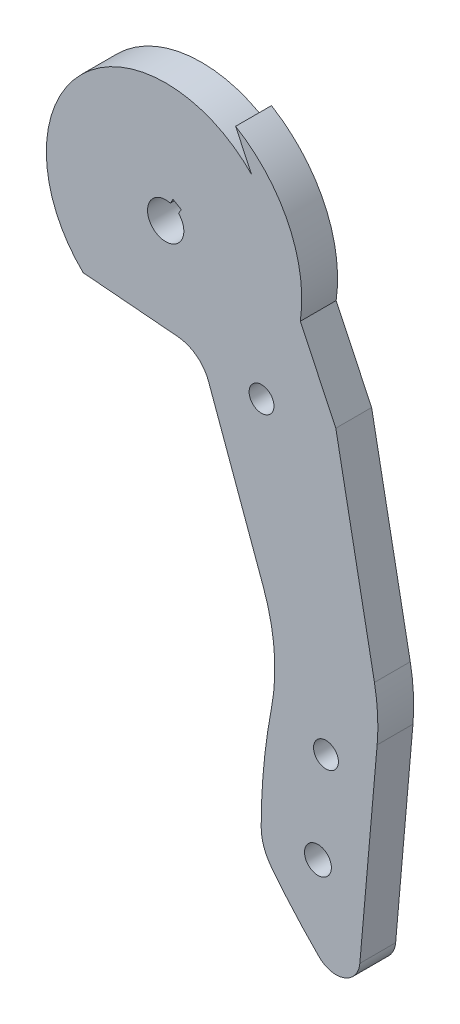
ISO-10303-21;
HEADER;
FILE_DESCRIPTION(('STEP AP214'),'2;1');
FILE_NAME('part.step','',(''),(''),'','','');
FILE_SCHEMA(('AUTOMOTIVE_DESIGN { 1 0 10303 214 1 1 1 1 }'));
ENDSEC;
DATA;
#1=APPLICATION_CONTEXT('core data for automotive mechanical design processes');
#2=APPLICATION_PROTOCOL_DEFINITION('international standard','automotive_design',2000,#1);
#3=PRODUCT_CONTEXT('',#1,'mechanical');
#4=PRODUCT('Part','Part','',(#3));
#5=PRODUCT_RELATED_PRODUCT_CATEGORY('part','',(#4));
#6=PRODUCT_DEFINITION_FORMATION('','',#4);
#7=PRODUCT_DEFINITION_CONTEXT('part definition',#1,'design');
#8=PRODUCT_DEFINITION('design','',#6,#7);
#9=PRODUCT_DEFINITION_SHAPE('','',#8);
#10=(LENGTH_UNIT() NAMED_UNIT(*) SI_UNIT(.MILLI.,.METRE.));
#11=(NAMED_UNIT(*) PLANE_ANGLE_UNIT() SI_UNIT($,.RADIAN.));
#12=(NAMED_UNIT(*) SI_UNIT($,.STERADIAN.) SOLID_ANGLE_UNIT());
#13=UNCERTAINTY_MEASURE_WITH_UNIT(LENGTH_MEASURE(1.E-05),#10,'distance_accuracy_value','');
#14=(GEOMETRIC_REPRESENTATION_CONTEXT(3) GLOBAL_UNCERTAINTY_ASSIGNED_CONTEXT((#13)) GLOBAL_UNIT_ASSIGNED_CONTEXT((#10,
#11,#12)) REPRESENTATION_CONTEXT('',''));
#15=CARTESIAN_POINT('',(0.,0.,0.));
#16=DIRECTION('',(0.,0.,1.));
#17=DIRECTION('',(1.,0.,0.));
#18=AXIS2_PLACEMENT_3D('',#15,#16,#17);
#19=CARTESIAN_POINT('',(48.5793874933535,165.239867540836,-1.58750011973733));
#20=DIRECTION('',(-0.866025403784435,0.500000000000006,0.));
#21=DIRECTION('',(-0.500000000000006,-0.866025403784435,0.));
#22=AXIS2_PLACEMENT_3D('',#19,#20,#21);
#23=PLANE('',#22);
#24=DIRECTION('',(-0.500000000000006,-0.866025403784435,0.));
#25=VECTOR('',#24,1.);
#26=CARTESIAN_POINT('',(48.5793874933535,165.239867540836,7.93749988026267));
#27=LINE('',#26,#25);
#28=CARTESIAN_POINT('',(47.8593359463911,163.992701677429,7.93749988026267));
#29=VERTEX_POINT('',#28);
#30=CARTESIAN_POINT('',(48.5793874933535,165.239867540836,7.93749988026267));
#31=VERTEX_POINT('',#30);
#32=EDGE_CURVE('E203',#29,#31,#27,.F.);
#33=ORIENTED_EDGE('',*,*,#32,.T.);
#34=DIRECTION('',(0.,0.,1.));
#35=VECTOR('',#34,1.);
#36=CARTESIAN_POINT('',(48.5793874933536,165.239867540836,-1.58750011973733));
#37=LINE('',#36,#35);
#38=CARTESIAN_POINT('',(48.5793874933536,165.239867540836,-1.58750011973733));
#39=VERTEX_POINT('',#38);
#40=EDGE_CURVE('E224',#39,#31,#37,.T.);
#41=ORIENTED_EDGE('',*,*,#40,.F.);
#42=DIRECTION('',(-0.500000000000006,-0.866025403784435,0.));
#43=VECTOR('',#42,1.);
#44=CARTESIAN_POINT('',(48.5793874933535,165.239867540836,-1.58750011973733));
#45=LINE('',#44,#43);
#46=CARTESIAN_POINT('',(47.8593359463911,163.992701677429,-1.58750011973733));
#47=VERTEX_POINT('',#46);
#48=EDGE_CURVE('E216',#39,#47,#45,.T.);
#49=ORIENTED_EDGE('',*,*,#48,.T.);
#50=DIRECTION('',(0.,0.,1.));
#51=VECTOR('',#50,1.);
#52=CARTESIAN_POINT('',(47.8593359463911,163.992701677429,-1.58750011973733));
#53=LINE('',#52,#51);
#54=EDGE_CURVE('E337',#47,#29,#53,.T.);
#55=ORIENTED_EDGE('',*,*,#54,.T.);
#56=EDGE_LOOP('',(#33,#41,#49,#55));
#57=FACE_BOUND('',#56,.T.);
#58=ADVANCED_FACE('F35',(#57),#23,.T.);
#59=CARTESIAN_POINT('',(45.6596314207786,165.262701677429,-1.58750011973733));
#60=DIRECTION('',(0.866025403784441,-0.499999999999997,0.));
#61=DIRECTION('',(0.499999999999997,0.866025403784441,0.));
#62=AXIS2_PLACEMENT_3D('',#59,#60,#61);
#63=PLANE('',#62);
#64=DIRECTION('',(0.499999999999997,0.866025403784441,0.));
#65=VECTOR('',#64,1.);
#66=CARTESIAN_POINT('',(45.6596314207786,165.262701677429,7.93749988026267));
#67=LINE('',#66,#65);
#68=CARTESIAN_POINT('',(46.3796829677411,166.509867540836,7.93749988026267));
#69=VERTEX_POINT('',#68);
#70=CARTESIAN_POINT('',(45.6596314207785,165.262701677429,7.93749988026267));
#71=VERTEX_POINT('',#70);
#72=EDGE_CURVE('E220',#69,#71,#67,.F.);
#73=ORIENTED_EDGE('',*,*,#72,.T.);
#74=DIRECTION('',(0.,0.,1.));
#75=VECTOR('',#74,1.);
#76=CARTESIAN_POINT('',(45.6596314207785,165.262701677429,-1.58750011973733));
#77=LINE('',#76,#75);
#78=CARTESIAN_POINT('',(45.6596314207785,165.262701677429,-1.58750011973733));
#79=VERTEX_POINT('',#78);
#80=EDGE_CURVE('E39',#71,#79,#77,.F.);
#81=ORIENTED_EDGE('',*,*,#80,.T.);
#82=DIRECTION('',(0.499999999999997,0.866025403784441,0.));
#83=VECTOR('',#82,1.);
#84=CARTESIAN_POINT('',(45.6596314207786,165.262701677429,-1.58750011973733));
#85=LINE('',#84,#83);
#86=CARTESIAN_POINT('',(46.3796829677411,166.509867540836,-1.58750011973733));
#87=VERTEX_POINT('',#86);
#88=EDGE_CURVE('E213',#79,#87,#85,.T.);
#89=ORIENTED_EDGE('',*,*,#88,.T.);
#90=DIRECTION('',(0.,0.,1.));
#91=VECTOR('',#90,1.);
#92=CARTESIAN_POINT('',(46.3796829677412,166.509867540836,-1.58750011973733));
#93=LINE('',#92,#91);
#94=EDGE_CURVE('E336',#69,#87,#93,.F.);
#95=ORIENTED_EDGE('',*,*,#94,.F.);
#96=EDGE_LOOP('',(#73,#81,#89,#95));
#97=FACE_BOUND('',#96,.T.);
#98=ADVANCED_FACE('F346',(#97),#63,.T.);
#99=CARTESIAN_POINT('',(52.840158656433,104.881659459124,-1.58750011973733));
#100=DIRECTION('',(0.,0.,1.));
#101=DIRECTION('',(1.,0.,0.));
#102=AXIS2_PLACEMENT_3D('',#99,#100,#101);
#103=PLANE('',#102);
#104=CARTESIAN_POINT('',(84.9272024071747,33.5955766793666,-1.58750011973733));
#105=DIRECTION('',(0.,0.,1.));
#106=DIRECTION('',(1.,0.,0.));
#107=AXIS2_PLACEMENT_3D('',#104,#105,#106);
#108=CIRCLE('',#107,3.571875);
#109=CARTESIAN_POINT('',(88.4990774071747,33.5955766793666,-1.58750011973733));
#110=VERTEX_POINT('',#109);
#111=EDGE_CURVE('E205',#110,#110,#108,.T.);
#112=ORIENTED_EDGE('',*,*,#111,.T.);
#113=EDGE_LOOP('',(#112));
#114=FACE_BOUND('',#113,.T.);
#115=CARTESIAN_POINT('',(87.0710320441589,58.9049424258165,-1.58750011973733));
#116=DIRECTION('',(0.,0.,1.));
#117=DIRECTION('',(1.,0.,0.));
#118=AXIS2_PLACEMENT_3D('',#115,#116,#117);
#119=CIRCLE('',#118,3.302);
#120=CARTESIAN_POINT('',(90.3730320441589,58.9049424258165,-1.58750011973733));
#121=VERTEX_POINT('',#120);
#122=EDGE_CURVE('E209',#121,#121,#119,.T.);
#123=ORIENTED_EDGE('',*,*,#122,.T.);
#124=EDGE_LOOP('',(#123));
#125=FACE_BOUND('',#124,.T.);
#126=ORIENTED_EDGE('',*,*,#88,.F.);
#127=CARTESIAN_POINT('',(44.4315352305473,160.595576679366,-1.58750011973733));
#128=DIRECTION('',(0.,0.,1.));
#129=DIRECTION('',(1.,0.,0.));
#130=AXIS2_PLACEMENT_3D('',#127,#128,#129);
#131=CIRCLE('',#130,4.82599999999998);
#132=EDGE_CURVE('E212',#79,#47,#131,.T.);
#133=ORIENTED_EDGE('',*,*,#132,.T.);
#134=ORIENTED_EDGE('',*,*,#48,.F.);
#135=DIRECTION('',(0.866025403784441,-0.499999999999996,0.));
#136=VECTOR('',#135,1.);
#137=CARTESIAN_POINT('',(46.3796829677412,166.509867540836,-1.58750011973733));
#138=LINE('',#137,#136);
#139=EDGE_CURVE('E221',#87,#39,#138,.T.);
#140=ORIENTED_EDGE('',*,*,#139,.F.);
#141=EDGE_LOOP('',(#126,#133,#134,#140));
#142=FACE_BOUND('',#141,.T.);
#143=CARTESIAN_POINT('',(69.9254113328199,132.281758828678,-1.58750011973733));
#144=DIRECTION('',(0.,0.,1.));
#145=DIRECTION('',(1.,0.,0.));
#146=AXIS2_PLACEMENT_3D('',#143,#144,#145);
#147=CIRCLE('',#146,3.302);
#148=CARTESIAN_POINT('',(73.2274113328199,132.281758828678,-1.58750011973733));
#149=VERTEX_POINT('',#148);
#150=EDGE_CURVE('E225',#149,#149,#147,.T.);
#151=ORIENTED_EDGE('',*,*,#150,.T.);
#152=EDGE_LOOP('',(#151));
#153=FACE_BOUND('',#152,.T.);
#154=DIRECTION('',(0.996427343573336,-0.0844544195373214,0.));
#155=VECTOR('',#154,1.);
#156=CARTESIAN_POINT('',(16.6499967314595,138.132454230869,-1.58750011973733));
#157=LINE('',#156,#155);
#158=CARTESIAN_POINT('',(22.5010817557449,137.636532483461,-1.58750011973733));
#159=VERTEX_POINT('',#158);
#160=CARTESIAN_POINT('',(47.6874878917737,135.501802516275,-1.58750011973733));
#161=VERTEX_POINT('',#160);
#162=EDGE_CURVE('E215',#159,#161,#157,.T.);
#163=ORIENTED_EDGE('',*,*,#162,.F.);
#164=CARTESIAN_POINT('',(44.4315352305473,160.595576679366,-1.58750011973733));
#165=DIRECTION('',(0.,0.,-1.));
#166=DIRECTION('',(1.,0.,0.));
#167=AXIS2_PLACEMENT_3D('',#164,#165,#166);
#168=CIRCLE('',#167,31.75);
#169=CARTESIAN_POINT('',(67.3273044085301,182.592082168842,-1.58750011973733));
#170=VERTEX_POINT('',#169);
#171=EDGE_CURVE('E197',#159,#170,#168,.T.);
#172=ORIENTED_EDGE('',*,*,#171,.T.);
#173=DIRECTION('',(-0.42838081104944,0.903598296105423,0.));
#174=VECTOR('',#173,1.);
#175=CARTESIAN_POINT('',(80.2468943524427,155.340349228001,-1.58750011973733));
#176=LINE('',#175,#174);
#177=CARTESIAN_POINT('',(63.0335019814284,191.649146483739,-1.58750011973733));
#178=VERTEX_POINT('',#177);
#179=EDGE_CURVE('E194',#170,#178,#176,.T.);
#180=ORIENTED_EDGE('',*,*,#179,.T.);
#181=CARTESIAN_POINT('',(44.4315352305473,160.595576679366,-1.58750011973733));
#182=DIRECTION('',(0.,0.,1.));
#183=DIRECTION('',(1.,0.,0.));
#184=AXIS2_PLACEMENT_3D('',#181,#182,#183);
#185=CIRCLE('',#184,36.1988586090214);
#186=CARTESIAN_POINT('',(80.2468943524427,155.340349228001,-1.58750011973733));
#187=VERTEX_POINT('',#186);
#188=EDGE_CURVE('E173',#178,#187,#185,.F.);
#189=ORIENTED_EDGE('',*,*,#188,.T.);
#190=DIRECTION('',(-0.42838081104944,0.903598296105423,0.));
#191=VECTOR('',#190,1.);
#192=CARTESIAN_POINT('',(89.6860114111691,135.430096782028,-1.58750011973733));
#193=LINE('',#192,#191);
#194=CARTESIAN_POINT('',(89.686011411169,135.430096782029,-1.58750011973733));
#195=VERTEX_POINT('',#194);
#196=EDGE_CURVE('E52',#195,#187,#193,.T.);
#197=ORIENTED_EDGE('',*,*,#196,.F.);
#198=DIRECTION('',(-0.188854836435321,0.982005015646554,0.));
#199=VECTOR('',#198,1.);
#200=CARTESIAN_POINT('',(99.9625213207617,81.9944291282766,-1.58750011973733));
#201=LINE('',#200,#199);
#202=CARTESIAN_POINT('',(99.962521320762,81.9944291282752,-1.58750011973733));
#203=VERTEX_POINT('',#202);
#204=EDGE_CURVE('E231',#203,#195,#201,.T.);
#205=ORIENTED_EDGE('',*,*,#204,.F.);
#206=CARTESIAN_POINT('',(50.0766665259175,72.4006034373596,-1.58750011973733));
#207=DIRECTION('',(0.,0.,1.));
#208=DIRECTION('',(1.,0.,0.));
#209=AXIS2_PLACEMENT_3D('',#206,#207,#208);
#210=CIRCLE('',#209,50.7999999999997);
#211=CARTESIAN_POINT('',(100.683357188978,67.9730917057788,-1.58750011973733));
#212=VERTEX_POINT('',#211);
#213=EDGE_CURVE('E235',#212,#203,#210,.T.);
#214=ORIENTED_EDGE('',*,*,#213,.F.);
#215=DIRECTION('',(0.0871557427476514,0.996194698091746,0.));
#216=VECTOR('',#215,1.);
#217=CARTESIAN_POINT('',(96.0777934554649,15.3312573480182,-1.58750011973733));
#218=LINE('',#217,#216);
#219=CARTESIAN_POINT('',(96.0777934554649,15.3312573480182,-1.58750011973733));
#220=VERTEX_POINT('',#219);
#221=EDGE_CURVE('E239',#220,#212,#218,.T.);
#222=ORIENTED_EDGE('',*,*,#221,.F.);
#223=CARTESIAN_POINT('',(89.7519571225822,15.8846963144658,-1.58750011973733));
#224=DIRECTION('',(0.,0.,1.));
#225=DIRECTION('',(1.,0.,0.));
#226=AXIS2_PLACEMENT_3D('',#223,#224,#225);
#227=CIRCLE('',#226,6.34999999999997);
#228=CARTESIAN_POINT('',(85.2736760375764,11.3827524539009,-1.58750011973733));
#229=VERTEX_POINT('',#228);
#230=EDGE_CURVE('E243',#229,#220,#227,.T.);
#231=ORIENTED_EDGE('',*,*,#230,.F.);
#232=CARTESIAN_POINT('',(192.752422077715,119.429405107461,-1.58750011973725));
#233=DIRECTION('',(0.,0.,1.));
#234=DIRECTION('',(1.,0.,0.));
#235=AXIS2_PLACEMENT_3D('',#232,#233,#234);
#236=CIRCLE('',#235,152.399999999999);
#237=CARTESIAN_POINT('',(72.5114546080773,25.7925013677214,-1.58750011973733));
#238=VERTEX_POINT('',#237);
#239=EDGE_CURVE('E247',#238,#229,#236,.T.);
#240=ORIENTED_EDGE('',*,*,#239,.F.);
#241=CARTESIAN_POINT('',(82.5315352305471,33.5955766793665,-1.58750011973734));
#242=DIRECTION('',(0.,0.,1.));
#243=DIRECTION('',(1.,0.,0.));
#244=AXIS2_PLACEMENT_3D('',#241,#242,#243);
#245=CIRCLE('',#244,12.6999999999998);
#246=CARTESIAN_POINT('',(69.8315352305474,33.5955766793666,-1.58750011973733));
#247=VERTEX_POINT('',#246);
#248=EDGE_CURVE('E251',#247,#238,#245,.T.);
#249=ORIENTED_EDGE('',*,*,#248,.F.);
#250=CARTESIAN_POINT('',(222.231535230547,33.5955766793666,-1.58750011973733));
#251=DIRECTION('',(0.,0.,1.));
#252=DIRECTION('',(1.,0.,0.));
#253=AXIS2_PLACEMENT_3D('',#250,#251,#252);
#254=CIRCLE('',#253,152.399999999999);
#255=CARTESIAN_POINT('',(72.558413093717,62.2960385190922,-1.58750011973733));
#256=VERTEX_POINT('',#255);
#257=EDGE_CURVE('E255',#256,#247,#254,.T.);
#258=ORIENTED_EDGE('',*,*,#257,.F.);
#259=CARTESIAN_POINT('',(22.6673723814405,71.8628591323342,-1.58750011973733));
#260=DIRECTION('',(0.,0.,1.));
#261=DIRECTION('',(1.,0.,0.));
#262=AXIS2_PLACEMENT_3D('',#259,#260,#261);
#263=CIRCLE('',#262,50.8000000000002);
#264=CARTESIAN_POINT('',(70.4037575173648,89.2374824132778,-1.58750011973733));
#265=VERTEX_POINT('',#264);
#266=EDGE_CURVE('E258',#256,#265,#263,.T.);
#267=ORIENTED_EDGE('',*,*,#266,.T.);
#268=DIRECTION('',(0.342020143325662,-0.939692620785911,0.));
#269=VECTOR('',#268,1.);
#270=CARTESIAN_POINT('',(55.8336317586666,129.268573933916,-1.58750011973733));
#271=LINE('',#270,#269);
#272=CARTESIAN_POINT('',(55.8336317586666,129.268573933916,-1.58750011973733));
#273=VERTEX_POINT('',#272);
#274=EDGE_CURVE('E262',#273,#265,#271,.T.);
#275=ORIENTED_EDGE('',*,*,#274,.F.);
#276=CARTESIAN_POINT('',(46.8830595456807,126.010832068739,-1.58750011973733));
#277=DIRECTION('',(0.,0.,1.));
#278=DIRECTION('',(1.,0.,0.));
#279=AXIS2_PLACEMENT_3D('',#276,#277,#278);
#280=CIRCLE('',#279,9.52500000000001);
#281=EDGE_CURVE('E265',#273,#161,#280,.T.);
#282=ORIENTED_EDGE('',*,*,#281,.T.);
#283=EDGE_LOOP('',(#163,#172,#180,#189,#197,#205,#214,#222,#231,#240,#249,#258,#267,#275,#282));
#284=FACE_BOUND('',#283,.T.);
#285=ADVANCED_FACE('F351',(#114,#125,#142,#153,#284),#103,.F.);
#286=CARTESIAN_POINT('',(16.6499967314595,138.132454230869,-1.58750011973733));
#287=DIRECTION('',(-0.0844544195373214,-0.996427343573336,0.));
#288=DIRECTION('',(0.996427343573336,-0.0844544195373214,0.));
#289=AXIS2_PLACEMENT_3D('',#286,#287,#288);
#290=PLANE('',#289);
#291=DIRECTION('',(0.,0.,1.));
#292=VECTOR('',#291,1.);
#293=CARTESIAN_POINT('',(22.5010817557449,137.636532483461,-1.58750011973733));
#294=LINE('',#293,#292);
#295=CARTESIAN_POINT('',(22.5010817557449,137.636532483461,7.93749988026267));
#296=VERTEX_POINT('',#295);
#297=EDGE_CURVE('E201',#159,#296,#294,.T.);
#298=ORIENTED_EDGE('',*,*,#297,.F.);
#299=ORIENTED_EDGE('',*,*,#162,.T.);
#300=DIRECTION('',(0.,0.,1.));
#301=VECTOR('',#300,1.);
#302=CARTESIAN_POINT('',(47.6874878917738,135.501802516275,-1.58750011973733));
#303=LINE('',#302,#301);
#304=CARTESIAN_POINT('',(47.6874878917737,135.501802516275,7.93749988026267));
#305=VERTEX_POINT('',#304);
#306=EDGE_CURVE('E268',#161,#305,#303,.T.);
#307=ORIENTED_EDGE('',*,*,#306,.T.);
#308=DIRECTION('',(0.996427343573336,-0.0844544195373229,0.));
#309=VECTOR('',#308,1.);
#310=CARTESIAN_POINT('',(16.6499967314595,138.132454230869,7.93749988026267));
#311=LINE('',#310,#309);
#312=EDGE_CURVE('E208',#296,#305,#311,.T.);
#313=ORIENTED_EDGE('',*,*,#312,.F.);
#314=EDGE_LOOP('',(#298,#299,#307,#313));
#315=FACE_BOUND('',#314,.T.);
#316=ADVANCED_FACE('F389',(#315),#290,.T.);
#317=CARTESIAN_POINT('',(46.8830595456807,126.010832068739,-1.58750011973733));
#318=DIRECTION('',(0.,0.,1.));
#319=DIRECTION('',(1.,0.,0.));
#320=AXIS2_PLACEMENT_3D('',#317,#318,#319);
#321=CYLINDRICAL_SURFACE('',#320,9.525);
#322=DIRECTION('',(0.,0.,1.));
#323=VECTOR('',#322,1.);
#324=CARTESIAN_POINT('',(55.8336317586666,129.268573933916,-1.58750011973733));
#325=LINE('',#324,#323);
#326=CARTESIAN_POINT('',(55.8336317586666,129.268573933916,7.93749988026267));
#327=VERTEX_POINT('',#326);
#328=EDGE_CURVE('E264',#327,#273,#325,.F.);
#329=ORIENTED_EDGE('',*,*,#328,.F.);
#330=CARTESIAN_POINT('',(46.8830595456806,126.010832068739,7.93749988026267));
#331=DIRECTION('',(0.,0.,-1.));
#332=DIRECTION('',(-1.,0.,0.));
#333=AXIS2_PLACEMENT_3D('',#330,#331,#332);
#334=CIRCLE('',#333,9.52500000000011);
#335=EDGE_CURVE('E284',#305,#327,#334,.T.);
#336=ORIENTED_EDGE('',*,*,#335,.F.);
#337=ORIENTED_EDGE('',*,*,#306,.F.);
#338=ORIENTED_EDGE('',*,*,#281,.F.);
#339=EDGE_LOOP('',(#329,#336,#337,#338));
#340=FACE_BOUND('',#339,.T.);
#341=ADVANCED_FACE('F392',(#340),#321,.F.);
#342=CARTESIAN_POINT('',(55.8336317586666,129.268573933916,-1.58750011973733));
#343=DIRECTION('',(-0.939692620785911,-0.342020143325662,0.));
#344=DIRECTION('',(0.342020143325662,-0.939692620785911,0.));
#345=AXIS2_PLACEMENT_3D('',#342,#343,#344);
#346=PLANE('',#345);
#347=DIRECTION('',(0.342020143325665,-0.93969262078591,0.));
#348=VECTOR('',#347,1.);
#349=CARTESIAN_POINT('',(55.8336317586666,129.268573933916,7.93749988026267));
#350=LINE('',#349,#348);
#351=CARTESIAN_POINT('',(70.4037575173649,89.2374824132779,7.93749988026267));
#352=VERTEX_POINT('',#351);
#353=EDGE_CURVE('E287',#327,#352,#350,.T.);
#354=ORIENTED_EDGE('',*,*,#353,.F.);
#355=ORIENTED_EDGE('',*,*,#328,.T.);
#356=ORIENTED_EDGE('',*,*,#274,.T.);
#357=DIRECTION('',(0.,0.,1.));
#358=VECTOR('',#357,1.);
#359=CARTESIAN_POINT('',(70.4037575173649,89.2374824132779,-1.58750011973733));
#360=LINE('',#359,#358);
#361=EDGE_CURVE('E261',#265,#352,#360,.T.);
#362=ORIENTED_EDGE('',*,*,#361,.T.);
#363=EDGE_LOOP('',(#354,#355,#356,#362));
#364=FACE_BOUND('',#363,.T.);
#365=ADVANCED_FACE('F396',(#364),#346,.T.);
#366=CARTESIAN_POINT('',(22.6673723814406,71.8628591323342,-1.58750011973733));
#367=DIRECTION('',(0.,0.,1.));
#368=DIRECTION('',(1.,0.,0.));
#369=AXIS2_PLACEMENT_3D('',#366,#367,#368);
#370=CYLINDRICAL_SURFACE('',#369,50.8);
#371=DIRECTION('',(0.,0.,1.));
#372=VECTOR('',#371,1.);
#373=CARTESIAN_POINT('',(72.558413093717,62.2960385190921,-1.58750011973733));
#374=LINE('',#373,#372);
#375=CARTESIAN_POINT('',(72.558413093717,62.2960385190922,7.93749988026267));
#376=VERTEX_POINT('',#375);
#377=EDGE_CURVE('E254',#376,#256,#374,.F.);
#378=ORIENTED_EDGE('',*,*,#377,.F.);
#379=CARTESIAN_POINT('',(22.6673723814404,71.8628591323342,7.93749988026267));
#380=DIRECTION('',(0.,0.,-1.));
#381=DIRECTION('',(-1.,0.,0.));
#382=AXIS2_PLACEMENT_3D('',#379,#380,#381);
#383=CIRCLE('',#382,50.8000000000002);
#384=EDGE_CURVE('E290',#352,#376,#383,.T.);
#385=ORIENTED_EDGE('',*,*,#384,.F.);
#386=ORIENTED_EDGE('',*,*,#361,.F.);
#387=ORIENTED_EDGE('',*,*,#266,.F.);
#388=EDGE_LOOP('',(#378,#385,#386,#387));
#389=FACE_BOUND('',#388,.T.);
#390=ADVANCED_FACE('F400',(#389),#370,.F.);
#391=CARTESIAN_POINT('',(222.231535230547,33.5955766793666,-1.58750011973733));
#392=DIRECTION('',(0.,0.,1.));
#393=DIRECTION('',(1.,0.,0.));
#394=AXIS2_PLACEMENT_3D('',#391,#392,#393);
#395=CYLINDRICAL_SURFACE('',#394,152.4);
#396=CARTESIAN_POINT('',(222.231535230547,33.5955766793666,7.93749988026267));
#397=DIRECTION('',(0.,0.,1.));
#398=DIRECTION('',(1.,0.,0.));
#399=AXIS2_PLACEMENT_3D('',#396,#397,#398);
#400=CIRCLE('',#399,152.399999999999);
#401=CARTESIAN_POINT('',(69.8315352305474,33.5955766793666,7.93749988026267));
#402=VERTEX_POINT('',#401);
#403=EDGE_CURVE('E293',#376,#402,#400,.T.);
#404=ORIENTED_EDGE('',*,*,#403,.F.);
#405=ORIENTED_EDGE('',*,*,#377,.T.);
#406=ORIENTED_EDGE('',*,*,#257,.T.);
#407=DIRECTION('',(0.,0.,1.));
#408=VECTOR('',#407,1.);
#409=CARTESIAN_POINT('',(69.8315352305474,33.5955766793666,-1.58750011973733));
#410=LINE('',#409,#408);
#411=EDGE_CURVE('E250',#402,#247,#410,.F.);
#412=ORIENTED_EDGE('',*,*,#411,.F.);
#413=EDGE_LOOP('',(#404,#405,#406,#412));
#414=FACE_BOUND('',#413,.T.);
#415=ADVANCED_FACE('F404',(#414),#395,.T.);
#416=CARTESIAN_POINT('',(82.5315352305473,33.5955766793666,-1.58750011973733));
#417=DIRECTION('',(0.,0.,1.));
#418=DIRECTION('',(1.,0.,0.));
#419=AXIS2_PLACEMENT_3D('',#416,#417,#418);
#420=CYLINDRICAL_SURFACE('',#419,12.7);
#421=CARTESIAN_POINT('',(82.5315352305471,33.5955766793665,7.93749988026267));
#422=DIRECTION('',(0.,0.,1.));
#423=DIRECTION('',(1.,0.,0.));
#424=AXIS2_PLACEMENT_3D('',#421,#422,#423);
#425=CIRCLE('',#424,12.6999999999998);
#426=CARTESIAN_POINT('',(72.5114546080773,25.7925013677214,7.93749988026267));
#427=VERTEX_POINT('',#426);
#428=EDGE_CURVE('E296',#402,#427,#425,.T.);
#429=ORIENTED_EDGE('',*,*,#428,.F.);
#430=ORIENTED_EDGE('',*,*,#411,.T.);
#431=ORIENTED_EDGE('',*,*,#248,.T.);
#432=DIRECTION('',(0.,0.,1.));
#433=VECTOR('',#432,1.);
#434=CARTESIAN_POINT('',(72.5114546080773,25.7925013677214,-1.58750011973733));
#435=LINE('',#434,#433);
#436=EDGE_CURVE('E246',#427,#238,#435,.F.);
#437=ORIENTED_EDGE('',*,*,#436,.F.);
#438=EDGE_LOOP('',(#429,#430,#431,#437));
#439=FACE_BOUND('',#438,.T.);
#440=ADVANCED_FACE('F408',(#439),#420,.T.);
#441=CARTESIAN_POINT('',(192.752422077716,119.429405107462,-1.58750011973733));
#442=DIRECTION('',(0.,0.,1.));
#443=DIRECTION('',(1.,0.,0.));
#444=AXIS2_PLACEMENT_3D('',#441,#442,#443);
#445=CYLINDRICAL_SURFACE('',#444,152.4);
#446=CARTESIAN_POINT('',(192.752422077715,119.429405107461,7.93749988026202));
#447=DIRECTION('',(0.,0.,1.));
#448=DIRECTION('',(1.,0.,0.));
#449=AXIS2_PLACEMENT_3D('',#446,#447,#448);
#450=CIRCLE('',#449,152.399999999999);
#451=CARTESIAN_POINT('',(85.2736760375764,11.3827524539009,7.93749988026267));
#452=VERTEX_POINT('',#451);
#453=EDGE_CURVE('E299',#427,#452,#450,.T.);
#454=ORIENTED_EDGE('',*,*,#453,.F.);
#455=ORIENTED_EDGE('',*,*,#436,.T.);
#456=ORIENTED_EDGE('',*,*,#239,.T.);
#457=DIRECTION('',(0.,0.,1.));
#458=VECTOR('',#457,1.);
#459=CARTESIAN_POINT('',(85.2736760375763,11.3827524539009,-1.58750011973733));
#460=LINE('',#459,#458);
#461=EDGE_CURVE('E242',#452,#229,#460,.F.);
#462=ORIENTED_EDGE('',*,*,#461,.F.);
#463=EDGE_LOOP('',(#454,#455,#456,#462));
#464=FACE_BOUND('',#463,.T.);
#465=ADVANCED_FACE('F412',(#464),#445,.T.);
#466=CARTESIAN_POINT('',(89.7519571225822,15.8846963144658,-1.58750011973733));
#467=DIRECTION('',(0.,0.,1.));
#468=DIRECTION('',(1.,0.,0.));
#469=AXIS2_PLACEMENT_3D('',#466,#467,#468);
#470=CYLINDRICAL_SURFACE('',#469,6.34999999999998);
#471=CARTESIAN_POINT('',(89.7519571225822,15.8846963144658,7.93749988026267));
#472=DIRECTION('',(0.,0.,1.));
#473=DIRECTION('',(0.,-1.,0.));
#474=AXIS2_PLACEMENT_3D('',#471,#472,#473);
#475=CIRCLE('',#474,6.34999999999997);
#476=CARTESIAN_POINT('',(96.0777934554649,15.3312573480182,7.93749988026267));
#477=VERTEX_POINT('',#476);
#478=EDGE_CURVE('E302',#452,#477,#475,.T.);
#479=ORIENTED_EDGE('',*,*,#478,.F.);
#480=ORIENTED_EDGE('',*,*,#461,.T.);
#481=ORIENTED_EDGE('',*,*,#230,.T.);
#482=DIRECTION('',(0.,0.,1.));
#483=VECTOR('',#482,1.);
#484=CARTESIAN_POINT('',(96.0777934554649,15.3312573480182,-1.58750011973733));
#485=LINE('',#484,#483);
#486=EDGE_CURVE('E238',#477,#220,#485,.F.);
#487=ORIENTED_EDGE('',*,*,#486,.F.);
#488=EDGE_LOOP('',(#479,#480,#481,#487));
#489=FACE_BOUND('',#488,.T.);
#490=ADVANCED_FACE('F416',(#489),#470,.T.);
#491=CARTESIAN_POINT('',(96.0777934554649,15.3312573480182,-1.58750011973733));
#492=DIRECTION('',(0.996194698091746,-0.0871557427476514,0.));
#493=DIRECTION('',(0.0871557427476514,0.996194698091746,0.));
#494=AXIS2_PLACEMENT_3D('',#491,#492,#493);
#495=PLANE('',#494);
#496=DIRECTION('',(0.0871557427476522,0.996194698091746,0.));
#497=VECTOR('',#496,1.);
#498=CARTESIAN_POINT('',(96.0777934554649,15.3312573480182,7.93749988026267));
#499=LINE('',#498,#497);
#500=CARTESIAN_POINT('',(100.683357188978,67.9730917057788,7.93749988026267));
#501=VERTEX_POINT('',#500);
#502=EDGE_CURVE('E305',#477,#501,#499,.T.);
#503=ORIENTED_EDGE('',*,*,#502,.F.);
#504=ORIENTED_EDGE('',*,*,#486,.T.);
#505=ORIENTED_EDGE('',*,*,#221,.T.);
#506=DIRECTION('',(0.,0.,1.));
#507=VECTOR('',#506,1.);
#508=CARTESIAN_POINT('',(100.683357188978,67.9730917057789,-1.58750011973733));
#509=LINE('',#508,#507);
#510=EDGE_CURVE('E234',#501,#212,#509,.F.);
#511=ORIENTED_EDGE('',*,*,#510,.F.);
#512=EDGE_LOOP('',(#503,#504,#505,#511));
#513=FACE_BOUND('',#512,.T.);
#514=ADVANCED_FACE('F420',(#513),#495,.T.);
#515=CARTESIAN_POINT('',(50.0766665259172,72.4006034373595,-1.58750011973733));
#516=DIRECTION('',(0.,0.,1.));
#517=DIRECTION('',(1.,0.,0.));
#518=AXIS2_PLACEMENT_3D('',#515,#516,#517);
#519=CYLINDRICAL_SURFACE('',#518,50.8);
#520=CARTESIAN_POINT('',(50.0766665259175,72.4006034373596,7.93749988026267));
#521=DIRECTION('',(0.,0.,1.));
#522=DIRECTION('',(1.,0.,0.));
#523=AXIS2_PLACEMENT_3D('',#520,#521,#522);
#524=CIRCLE('',#523,50.7999999999997);
#525=CARTESIAN_POINT('',(99.962521320762,81.9944291282752,7.93749988026267));
#526=VERTEX_POINT('',#525);
#527=EDGE_CURVE('E308',#501,#526,#524,.T.);
#528=ORIENTED_EDGE('',*,*,#527,.F.);
#529=ORIENTED_EDGE('',*,*,#510,.T.);
#530=ORIENTED_EDGE('',*,*,#213,.T.);
#531=DIRECTION('',(0.,0.,1.));
#532=VECTOR('',#531,1.);
#533=CARTESIAN_POINT('',(99.9625213207617,81.9944291282766,-1.58750011973733));
#534=LINE('',#533,#532);
#535=EDGE_CURVE('E230',#526,#203,#534,.F.);
#536=ORIENTED_EDGE('',*,*,#535,.F.);
#537=EDGE_LOOP('',(#528,#529,#530,#536));
#538=FACE_BOUND('',#537,.T.);
#539=ADVANCED_FACE('F424',(#538),#519,.T.);
#540=CARTESIAN_POINT('',(99.9625213207617,81.9944291282766,-1.58750011973733));
#541=DIRECTION('',(0.982005015646554,0.188854836435321,0.));
#542=DIRECTION('',(-0.188854836435321,0.982005015646554,0.));
#543=AXIS2_PLACEMENT_3D('',#540,#541,#542);
#544=PLANE('',#543);
#545=DIRECTION('',(-0.18885483643532,0.982005015646554,0.));
#546=VECTOR('',#545,1.);
#547=CARTESIAN_POINT('',(99.9625213207617,81.9944291282766,7.93749988026267));
#548=LINE('',#547,#546);
#549=CARTESIAN_POINT('',(89.6860114111691,135.430096782029,7.93749988026267));
#550=VERTEX_POINT('',#549);
#551=EDGE_CURVE('E311',#526,#550,#548,.T.);
#552=ORIENTED_EDGE('',*,*,#551,.F.);
#553=ORIENTED_EDGE('',*,*,#535,.T.);
#554=ORIENTED_EDGE('',*,*,#204,.T.);
#555=DIRECTION('',(0.,0.,1.));
#556=VECTOR('',#555,1.);
#557=CARTESIAN_POINT('',(89.6860114111691,135.430096782028,-1.58750011973733));
#558=LINE('',#557,#556);
#559=EDGE_CURVE('E228',#550,#195,#558,.F.);
#560=ORIENTED_EDGE('',*,*,#559,.F.);
#561=EDGE_LOOP('',(#552,#553,#554,#560));
#562=FACE_BOUND('',#561,.T.);
#563=ADVANCED_FACE('F428',(#562),#544,.T.);
#564=CARTESIAN_POINT('',(89.6860114111691,135.430096782028,-1.58750011973733));
#565=DIRECTION('',(0.903598296105423,0.42838081104944,0.));
#566=DIRECTION('',(-0.42838081104944,0.903598296105423,0.));
#567=AXIS2_PLACEMENT_3D('',#564,#565,#566);
#568=PLANE('',#567);
#569=DIRECTION('',(0.,0.,1.));
#570=VECTOR('',#569,1.);
#571=CARTESIAN_POINT('',(80.2468943524427,155.340349228001,-41.9357263660713));
#572=LINE('',#571,#570);
#573=CARTESIAN_POINT('',(80.2468943524427,155.340349228001,7.93749988026267));
#574=VERTEX_POINT('',#573);
#575=EDGE_CURVE('E57',#187,#574,#572,.T.);
#576=ORIENTED_EDGE('',*,*,#575,.T.);
#577=DIRECTION('',(-0.428380811049439,0.903598296105423,0.));
#578=VECTOR('',#577,1.);
#579=CARTESIAN_POINT('',(89.6860114111691,135.430096782028,7.93749988026267));
#580=LINE('',#579,#578);
#581=EDGE_CURVE('E185',#550,#574,#580,.T.);
#582=ORIENTED_EDGE('',*,*,#581,.F.);
#583=ORIENTED_EDGE('',*,*,#559,.T.);
#584=ORIENTED_EDGE('',*,*,#196,.T.);
#585=EDGE_LOOP('',(#576,#582,#583,#584));
#586=FACE_BOUND('',#585,.T.);
#587=ADVANCED_FACE('F432',(#586),#568,.T.);
#588=CARTESIAN_POINT('',(69.9254113328199,132.281758828678,-1.58750011973733));
#589=DIRECTION('',(0.,0.,1.));
#590=DIRECTION('',(1.,0.,0.));
#591=AXIS2_PLACEMENT_3D('',#588,#589,#590);
#592=CYLINDRICAL_SURFACE('',#591,3.302);
#593=CARTESIAN_POINT('',(69.9254113328199,132.281758828678,7.93749988026267));
#594=DIRECTION('',(0.,0.,-1.));
#595=DIRECTION('',(0.,1.,0.));
#596=AXIS2_PLACEMENT_3D('',#593,#594,#595);
#597=CIRCLE('',#596,3.302);
#598=CARTESIAN_POINT('',(73.2274113328199,132.281758828678,7.93749988026267));
#599=VERTEX_POINT('',#598);
#600=EDGE_CURVE('E279',#599,#599,#597,.T.);
#601=CARTESIAN_POINT('',(73.2274113328199,132.281758828678,7.93749988026267));
#602=CARTESIAN_POINT('',(73.2274113328199,132.281758828678,7.83828113026267));
#603=CARTESIAN_POINT('',(73.2274113328199,132.281758828678,7.73906238026267));
#604=CARTESIAN_POINT('',(73.2274113328199,132.281758828678,7.54062488026267));
#605=CARTESIAN_POINT('',(73.2274113328199,132.281758828678,7.44140613026267));
#606=CARTESIAN_POINT('',(73.2274113328199,132.281758828678,7.24296863026267));
#607=CARTESIAN_POINT('',(73.2274113328199,132.281758828678,7.14374988026267));
#608=CARTESIAN_POINT('',(73.2274113328199,132.281758828678,6.94531238026267));
#609=CARTESIAN_POINT('',(73.2274113328199,132.281758828678,6.84609363026267));
#610=CARTESIAN_POINT('',(73.2274113328199,132.281758828678,6.64765613026267));
#611=CARTESIAN_POINT('',(73.2274113328199,132.281758828678,6.54843738026267));
#612=CARTESIAN_POINT('',(73.2274113328199,132.281758828678,6.34999988026267));
#613=CARTESIAN_POINT('',(73.2274113328199,132.281758828678,6.25078113026267));
#614=CARTESIAN_POINT('',(73.2274113328199,132.281758828678,6.05234363026267));
#615=CARTESIAN_POINT('',(73.2274113328199,132.281758828678,5.95312488026267));
#616=CARTESIAN_POINT('',(73.2274113328199,132.281758828678,5.75468738026267));
#617=CARTESIAN_POINT('',(73.2274113328199,132.281758828678,5.65546863026267));
#618=CARTESIAN_POINT('',(73.2274113328199,132.281758828678,5.45703113026267));
#619=CARTESIAN_POINT('',(73.2274113328199,132.281758828678,5.35781238026267));
#620=CARTESIAN_POINT('',(73.2274113328199,132.281758828678,5.15937488026267));
#621=CARTESIAN_POINT('',(73.2274113328199,132.281758828678,5.06015613026267));
#622=CARTESIAN_POINT('',(73.2274113328199,132.281758828678,4.86171863026267));
#623=CARTESIAN_POINT('',(73.2274113328199,132.281758828678,4.76249988026267));
#624=CARTESIAN_POINT('',(73.2274113328199,132.281758828678,4.56406238026267));
#625=CARTESIAN_POINT('',(73.2274113328199,132.281758828678,4.46484363026267));
#626=CARTESIAN_POINT('',(73.2274113328199,132.281758828678,4.26640613026267));
#627=CARTESIAN_POINT('',(73.2274113328199,132.281758828678,4.16718738026267));
#628=CARTESIAN_POINT('',(73.2274113328199,132.281758828678,3.96874988026267));
#629=CARTESIAN_POINT('',(73.2274113328199,132.281758828678,3.86953113026267));
#630=CARTESIAN_POINT('',(73.2274113328199,132.281758828678,3.67109363026267));
#631=CARTESIAN_POINT('',(73.2274113328199,132.281758828678,3.57187488026267));
#632=CARTESIAN_POINT('',(73.2274113328199,132.281758828678,3.37343738026267));
#633=CARTESIAN_POINT('',(73.2274113328199,132.281758828678,3.27421863026267));
#634=CARTESIAN_POINT('',(73.2274113328199,132.281758828678,3.07578113026267));
#635=CARTESIAN_POINT('',(73.2274113328199,132.281758828678,2.97656238026267));
#636=CARTESIAN_POINT('',(73.2274113328199,132.281758828678,2.77812488026267));
#637=CARTESIAN_POINT('',(73.2274113328199,132.281758828678,2.67890613026267));
#638=CARTESIAN_POINT('',(73.2274113328199,132.281758828678,2.48046863026267));
#639=CARTESIAN_POINT('',(73.2274113328199,132.281758828678,2.38124988026267));
#640=CARTESIAN_POINT('',(73.2274113328199,132.281758828678,2.18281238026267));
#641=CARTESIAN_POINT('',(73.2274113328199,132.281758828678,2.08359363026267));
#642=CARTESIAN_POINT('',(73.2274113328199,132.281758828678,1.88515613026267));
#643=CARTESIAN_POINT('',(73.2274113328199,132.281758828678,1.78593738026267));
#644=CARTESIAN_POINT('',(73.2274113328199,132.281758828678,1.58749988026267));
#645=CARTESIAN_POINT('',(73.2274113328199,132.281758828678,1.48828113026267));
#646=CARTESIAN_POINT('',(73.2274113328199,132.281758828678,1.28984363026267));
#647=CARTESIAN_POINT('',(73.2274113328199,132.281758828678,1.19062488026267));
#648=CARTESIAN_POINT('',(73.2274113328199,132.281758828678,0.992187380262667));
#649=CARTESIAN_POINT('',(73.2274113328199,132.281758828678,0.892968630262667));
#650=CARTESIAN_POINT('',(73.2274113328199,132.281758828678,0.694531130262667));
#651=CARTESIAN_POINT('',(73.2274113328199,132.281758828678,0.595312380262667));
#652=CARTESIAN_POINT('',(73.2274113328199,132.281758828678,0.396874880262667));
#653=CARTESIAN_POINT('',(73.2274113328199,132.281758828678,0.297656130262667));
#654=CARTESIAN_POINT('',(73.2274113328199,132.281758828678,0.0992186302626674));
#655=CARTESIAN_POINT('',(73.2274113328199,132.281758828678,-1.19737332394498E-07));
#656=CARTESIAN_POINT('',(73.2274113328199,132.281758828678,-0.198437619737332));
#657=CARTESIAN_POINT('',(73.2274113328199,132.281758828678,-0.297656369737332));
#658=CARTESIAN_POINT('',(73.2274113328199,132.281758828678,-0.496093869737332));
#659=CARTESIAN_POINT('',(73.2274113328199,132.281758828678,-0.595312619737332));
#660=CARTESIAN_POINT('',(73.2274113328199,132.281758828678,-0.793750119737332));
#661=CARTESIAN_POINT('',(73.2274113328199,132.281758828678,-0.892968869737332));
#662=CARTESIAN_POINT('',(73.2274113328199,132.281758828678,-1.09140636973733));
#663=CARTESIAN_POINT('',(73.2274113328199,132.281758828678,-1.19062511973733));
#664=CARTESIAN_POINT('',(73.2274113328199,132.281758828678,-1.38906261973733));
#665=CARTESIAN_POINT('',(73.2274113328199,132.281758828678,-1.48828136973733));
#666=CARTESIAN_POINT('',(73.2274113328199,132.281758828678,-1.58750011973733));
#667=B_SPLINE_CURVE_WITH_KNOTS('',3,(#601,#602,#603,#604,#605,#606,#607,#608,#609,#610,#611,
#612,#613,#614,#615,#616,#617,#618,#619,#620,#621,#622,#623,#624,#625,#626,#627,#628,#629,#630,
#631,#632,#633,#634,#635,#636,#637,#638,#639,#640,#641,#642,#643,#644,#645,#646,#647,#648,#649,
#650,#651,#652,#653,#654,#655,#656,#657,#658,#659,#660,#661,#662,#663,#664,#665,#666),
.UNSPECIFIED.,.F.,.F.,(4,2,2,2,2,2,2,2,2,2,2,2,2,2,2,2,2,2,2,2,2,2,2,2,2,2,2,2,2,2,2,2,4),(0.,
0.29765625,0.5953125,0.892968750000001,1.190625,1.48828125,1.7859375,2.08359375,2.38125,
2.67890625,2.9765625,3.27421875,3.571875,3.86953125,4.1671875,4.46484375,4.7625,5.06015625,
5.3578125,5.65546875,5.953125,6.25078125,6.5484375,6.84609375,7.14375,7.44140625,7.7390625,
8.03671875,8.334375,8.63203125,8.9296875,9.22734375,9.525),.UNSPECIFIED.);
#668=EDGE_CURVE('BSEAM369',#599,#149,#667,.T.);
#669=ORIENTED_EDGE('',*,*,#600,.F.);
#670=ORIENTED_EDGE('',*,*,#150,.F.);
#671=ORIENTED_EDGE('',*,*,#668,.T.);
#672=ORIENTED_EDGE('',*,*,#668,.F.);
#673=EDGE_LOOP('',(#669,#671,#670,#672));
#674=FACE_BOUND('',#673,.T.);
#675=ADVANCED_FACE('F369',(#674),#592,.F.);
#676=CARTESIAN_POINT('',(46.3796829677412,166.509867540836,-1.58750011973733));
#677=DIRECTION('',(-0.499999999999996,-0.866025403784441,0.));
#678=DIRECTION('',(0.866025403784441,-0.499999999999996,0.));
#679=AXIS2_PLACEMENT_3D('',#676,#677,#678);
#680=PLANE('',#679);
#681=DIRECTION('',(0.86602540378443,-0.500000000000016,0.));
#682=VECTOR('',#681,1.);
#683=CARTESIAN_POINT('',(46.3796829677412,166.509867540836,7.93749988026267));
#684=LINE('',#683,#682);
#685=EDGE_CURVE('E275',#69,#31,#684,.T.);
#686=ORIENTED_EDGE('',*,*,#685,.F.);
#687=ORIENTED_EDGE('',*,*,#94,.T.);
#688=ORIENTED_EDGE('',*,*,#139,.T.);
#689=ORIENTED_EDGE('',*,*,#40,.T.);
#690=EDGE_LOOP('',(#686,#687,#688,#689));
#691=FACE_BOUND('',#690,.T.);
#692=ADVANCED_FACE('F343',(#691),#680,.T.);
#693=CARTESIAN_POINT('',(44.4315352305473,160.595576679366,-1.58750011973733));
#694=DIRECTION('',(0.,0.,1.));
#695=DIRECTION('',(1.,0.,0.));
#696=AXIS2_PLACEMENT_3D('',#693,#694,#695);
#697=CYLINDRICAL_SURFACE('',#696,4.82599999999998);
#698=ORIENTED_EDGE('',*,*,#80,.F.);
#699=CARTESIAN_POINT('',(44.4315352305473,160.595576679366,7.93749988026267));
#700=DIRECTION('',(0.,0.,-1.));
#701=DIRECTION('',(-1.,0.,0.));
#702=AXIS2_PLACEMENT_3D('',#699,#700,#701);
#703=CIRCLE('',#702,4.82599999999998);
#704=EDGE_CURVE('E272',#29,#71,#703,.T.);
#705=ORIENTED_EDGE('',*,*,#704,.F.);
#706=ORIENTED_EDGE('',*,*,#54,.F.);
#707=ORIENTED_EDGE('',*,*,#132,.F.);
#708=EDGE_LOOP('',(#698,#705,#706,#707));
#709=FACE_BOUND('',#708,.T.);
#710=ADVANCED_FACE('F360',(#709),#697,.F.);
#711=CARTESIAN_POINT('',(87.0710320441589,58.9049424258165,-1.58750011973733));
#712=DIRECTION('',(0.,0.,1.));
#713=DIRECTION('',(1.,0.,0.));
#714=AXIS2_PLACEMENT_3D('',#711,#712,#713);
#715=CYLINDRICAL_SURFACE('',#714,3.302);
#716=CARTESIAN_POINT('',(87.0710320441589,58.9049424258165,7.93749988026267));
#717=DIRECTION('',(0.,0.,-1.));
#718=DIRECTION('',(0.,1.,0.));
#719=AXIS2_PLACEMENT_3D('',#716,#717,#718);
#720=CIRCLE('',#719,3.302);
#721=CARTESIAN_POINT('',(90.3730320441589,58.9049424258165,7.93749988026267));
#722=VERTEX_POINT('',#721);
#723=EDGE_CURVE('E44',#722,#722,#720,.T.);
#724=CARTESIAN_POINT('',(90.3730320441589,58.9049424258165,7.93749988026267));
#725=CARTESIAN_POINT('',(90.3730320441589,58.9049424258165,7.83828113026267));
#726=CARTESIAN_POINT('',(90.3730320441589,58.9049424258165,7.73906238026267));
#727=CARTESIAN_POINT('',(90.3730320441589,58.9049424258165,7.54062488026267));
#728=CARTESIAN_POINT('',(90.3730320441589,58.9049424258165,7.44140613026267));
#729=CARTESIAN_POINT('',(90.3730320441589,58.9049424258165,7.24296863026267));
#730=CARTESIAN_POINT('',(90.3730320441589,58.9049424258165,7.14374988026267));
#731=CARTESIAN_POINT('',(90.3730320441589,58.9049424258165,6.94531238026267));
#732=CARTESIAN_POINT('',(90.3730320441589,58.9049424258165,6.84609363026267));
#733=CARTESIAN_POINT('',(90.3730320441589,58.9049424258165,6.64765613026267));
#734=CARTESIAN_POINT('',(90.3730320441589,58.9049424258165,6.54843738026267));
#735=CARTESIAN_POINT('',(90.3730320441589,58.9049424258165,6.34999988026267));
#736=CARTESIAN_POINT('',(90.3730320441589,58.9049424258165,6.25078113026267));
#737=CARTESIAN_POINT('',(90.3730320441589,58.9049424258165,6.05234363026267));
#738=CARTESIAN_POINT('',(90.3730320441589,58.9049424258165,5.95312488026267));
#739=CARTESIAN_POINT('',(90.3730320441589,58.9049424258165,5.75468738026267));
#740=CARTESIAN_POINT('',(90.3730320441589,58.9049424258165,5.65546863026267));
#741=CARTESIAN_POINT('',(90.3730320441589,58.9049424258165,5.45703113026267));
#742=CARTESIAN_POINT('',(90.3730320441589,58.9049424258165,5.35781238026267));
#743=CARTESIAN_POINT('',(90.3730320441589,58.9049424258165,5.15937488026267));
#744=CARTESIAN_POINT('',(90.3730320441589,58.9049424258165,5.06015613026267));
#745=CARTESIAN_POINT('',(90.3730320441589,58.9049424258165,4.86171863026267));
#746=CARTESIAN_POINT('',(90.3730320441589,58.9049424258165,4.76249988026267));
#747=CARTESIAN_POINT('',(90.3730320441589,58.9049424258165,4.56406238026267));
#748=CARTESIAN_POINT('',(90.3730320441589,58.9049424258165,4.46484363026267));
#749=CARTESIAN_POINT('',(90.3730320441589,58.9049424258165,4.26640613026267));
#750=CARTESIAN_POINT('',(90.3730320441589,58.9049424258165,4.16718738026267));
#751=CARTESIAN_POINT('',(90.3730320441589,58.9049424258165,3.96874988026267));
#752=CARTESIAN_POINT('',(90.3730320441589,58.9049424258165,3.86953113026267));
#753=CARTESIAN_POINT('',(90.3730320441589,58.9049424258165,3.67109363026267));
#754=CARTESIAN_POINT('',(90.3730320441589,58.9049424258165,3.57187488026267));
#755=CARTESIAN_POINT('',(90.3730320441589,58.9049424258165,3.37343738026267));
#756=CARTESIAN_POINT('',(90.3730320441589,58.9049424258165,3.27421863026267));
#757=CARTESIAN_POINT('',(90.3730320441589,58.9049424258165,3.07578113026267));
#758=CARTESIAN_POINT('',(90.3730320441589,58.9049424258165,2.97656238026267));
#759=CARTESIAN_POINT('',(90.3730320441589,58.9049424258165,2.77812488026267));
#760=CARTESIAN_POINT('',(90.3730320441589,58.9049424258165,2.67890613026267));
#761=CARTESIAN_POINT('',(90.3730320441589,58.9049424258165,2.48046863026267));
#762=CARTESIAN_POINT('',(90.3730320441589,58.9049424258165,2.38124988026267));
#763=CARTESIAN_POINT('',(90.3730320441589,58.9049424258165,2.18281238026267));
#764=CARTESIAN_POINT('',(90.3730320441589,58.9049424258165,2.08359363026267));
#765=CARTESIAN_POINT('',(90.3730320441589,58.9049424258165,1.88515613026267));
#766=CARTESIAN_POINT('',(90.3730320441589,58.9049424258165,1.78593738026267));
#767=CARTESIAN_POINT('',(90.3730320441589,58.9049424258165,1.58749988026267));
#768=CARTESIAN_POINT('',(90.3730320441589,58.9049424258165,1.48828113026267));
#769=CARTESIAN_POINT('',(90.3730320441589,58.9049424258165,1.28984363026267));
#770=CARTESIAN_POINT('',(90.3730320441589,58.9049424258165,1.19062488026267));
#771=CARTESIAN_POINT('',(90.3730320441589,58.9049424258165,0.992187380262667));
#772=CARTESIAN_POINT('',(90.3730320441589,58.9049424258165,0.892968630262667));
#773=CARTESIAN_POINT('',(90.3730320441589,58.9049424258165,0.694531130262667));
#774=CARTESIAN_POINT('',(90.3730320441589,58.9049424258165,0.595312380262667));
#775=CARTESIAN_POINT('',(90.3730320441589,58.9049424258165,0.396874880262667));
#776=CARTESIAN_POINT('',(90.3730320441589,58.9049424258165,0.297656130262667));
#777=CARTESIAN_POINT('',(90.3730320441589,58.9049424258165,0.0992186302626674));
#778=CARTESIAN_POINT('',(90.3730320441589,58.9049424258165,-1.19737332394498E-07));
#779=CARTESIAN_POINT('',(90.3730320441589,58.9049424258165,-0.198437619737332));
#780=CARTESIAN_POINT('',(90.3730320441589,58.9049424258165,-0.297656369737332));
#781=CARTESIAN_POINT('',(90.3730320441589,58.9049424258165,-0.496093869737332));
#782=CARTESIAN_POINT('',(90.3730320441589,58.9049424258165,-0.595312619737332));
#783=CARTESIAN_POINT('',(90.3730320441589,58.9049424258165,-0.793750119737332));
#784=CARTESIAN_POINT('',(90.3730320441589,58.9049424258165,-0.892968869737332));
#785=CARTESIAN_POINT('',(90.3730320441589,58.9049424258165,-1.09140636973733));
#786=CARTESIAN_POINT('',(90.3730320441589,58.9049424258165,-1.19062511973733));
#787=CARTESIAN_POINT('',(90.3730320441589,58.9049424258165,-1.38906261973733));
#788=CARTESIAN_POINT('',(90.3730320441589,58.9049424258165,-1.48828136973733));
#789=CARTESIAN_POINT('',(90.3730320441589,58.9049424258165,-1.58750011973733));
#790=B_SPLINE_CURVE_WITH_KNOTS('',3,(#724,#725,#726,#727,#728,#729,#730,#731,#732,#733,#734,
#735,#736,#737,#738,#739,#740,#741,#742,#743,#744,#745,#746,#747,#748,#749,#750,#751,#752,#753,
#754,#755,#756,#757,#758,#759,#760,#761,#762,#763,#764,#765,#766,#767,#768,#769,#770,#771,#772,
#773,#774,#775,#776,#777,#778,#779,#780,#781,#782,#783,#784,#785,#786,#787,#788,#789),
.UNSPECIFIED.,.F.,.F.,(4,2,2,2,2,2,2,2,2,2,2,2,2,2,2,2,2,2,2,2,2,2,2,2,2,2,2,2,2,2,2,2,4),(0.,
0.29765625,0.5953125,0.892968750000001,1.190625,1.48828125,1.7859375,2.08359375,2.38125,
2.67890625,2.9765625,3.27421875,3.571875,3.86953125,4.1671875,4.46484375,4.7625,5.06015625,
5.3578125,5.65546875,5.953125,6.25078125,6.5484375,6.84609375,7.14375,7.44140625,7.7390625,
8.03671875,8.334375,8.63203125,8.9296875,9.22734375,9.525),.UNSPECIFIED.);
#791=EDGE_CURVE('BSEAM362',#722,#121,#790,.T.);
#792=ORIENTED_EDGE('',*,*,#723,.F.);
#793=ORIENTED_EDGE('',*,*,#122,.F.);
#794=ORIENTED_EDGE('',*,*,#791,.T.);
#795=ORIENTED_EDGE('',*,*,#791,.F.);
#796=EDGE_LOOP('',(#792,#794,#793,#795));
#797=FACE_BOUND('',#796,.T.);
#798=ADVANCED_FACE('F362',(#797),#715,.F.);
#799=CARTESIAN_POINT('',(84.9272024071747,33.5955766793666,-1.58750011973733));
#800=DIRECTION('',(0.,0.,1.));
#801=DIRECTION('',(1.,0.,0.));
#802=AXIS2_PLACEMENT_3D('',#799,#800,#801);
#803=CYLINDRICAL_SURFACE('',#802,3.571875);
#804=CARTESIAN_POINT('',(84.9272024071747,33.5955766793666,7.93749988026267));
#805=DIRECTION('',(0.,0.,-1.));
#806=DIRECTION('',(0.,1.,0.));
#807=AXIS2_PLACEMENT_3D('',#804,#805,#806);
#808=CIRCLE('',#807,3.571875);
#809=CARTESIAN_POINT('',(84.9272024071747,37.1674516793666,7.93749988026267));
#810=VERTEX_POINT('',#809);
#811=EDGE_CURVE('E11',#810,#810,#808,.T.);
#812=ORIENTED_EDGE('',*,*,#811,.F.);
#813=EDGE_LOOP('',(#812));
#814=FACE_BOUND('',#813,.T.);
#815=ORIENTED_EDGE('',*,*,#111,.F.);
#816=EDGE_LOOP('',(#815));
#817=FACE_BOUND('',#816,.T.);
#818=ADVANCED_FACE('F37',(#814,#817),#803,.F.);
#819=CARTESIAN_POINT('',(52.840158656433,104.881659459124,7.93749988026267));
#820=DIRECTION('',(0.,0.,1.));
#821=DIRECTION('',(1.,0.,0.));
#822=AXIS2_PLACEMENT_3D('',#819,#820,#821);
#823=PLANE('',#822);
#824=CARTESIAN_POINT('',(44.4315352305473,160.595576679366,7.93749988026267));
#825=DIRECTION('',(0.,0.,-1.));
#826=DIRECTION('',(1.,0.,0.));
#827=AXIS2_PLACEMENT_3D('',#824,#825,#826);
#828=CIRCLE('',#827,31.75);
#829=CARTESIAN_POINT('',(67.3273044085302,182.592082168842,7.93749988026267));
#830=VERTEX_POINT('',#829);
#831=EDGE_CURVE('E196',#296,#830,#828,.T.);
#832=ORIENTED_EDGE('',*,*,#831,.F.);
#833=ORIENTED_EDGE('',*,*,#312,.T.);
#834=ORIENTED_EDGE('',*,*,#335,.T.);
#835=ORIENTED_EDGE('',*,*,#353,.T.);
#836=ORIENTED_EDGE('',*,*,#384,.T.);
#837=ORIENTED_EDGE('',*,*,#403,.T.);
#838=ORIENTED_EDGE('',*,*,#428,.T.);
#839=ORIENTED_EDGE('',*,*,#453,.T.);
#840=ORIENTED_EDGE('',*,*,#478,.T.);
#841=ORIENTED_EDGE('',*,*,#502,.T.);
#842=ORIENTED_EDGE('',*,*,#527,.T.);
#843=ORIENTED_EDGE('',*,*,#551,.T.);
#844=ORIENTED_EDGE('',*,*,#581,.T.);
#845=CARTESIAN_POINT('',(44.4315352305473,160.595576679366,7.93749988026267));
#846=DIRECTION('',(0.,0.,1.));
#847=DIRECTION('',(1.,0.,0.));
#848=AXIS2_PLACEMENT_3D('',#845,#846,#847);
#849=CIRCLE('',#848,36.1988586090214);
#850=CARTESIAN_POINT('',(63.0335019814284,191.649146483739,7.93749988026267));
#851=VERTEX_POINT('',#850);
#852=EDGE_CURVE('E172',#574,#851,#849,.T.);
#853=ORIENTED_EDGE('',*,*,#852,.T.);
#854=DIRECTION('',(0.42838081104944,-0.903598296105423,0.));
#855=VECTOR('',#854,1.);
#856=CARTESIAN_POINT('',(80.2468943524427,155.340349228001,7.93749988026267));
#857=LINE('',#856,#855);
#858=EDGE_CURVE('E177',#851,#830,#857,.T.);
#859=ORIENTED_EDGE('',*,*,#858,.T.);
#860=EDGE_LOOP('',(#832,#833,#834,#835,#836,#837,#838,#839,#840,#841,#842,#843,#844,#853,#859));
#861=FACE_BOUND('',#860,.T.);
#862=ORIENTED_EDGE('',*,*,#811,.T.);
#863=EDGE_LOOP('',(#862));
#864=FACE_BOUND('',#863,.T.);
#865=ORIENTED_EDGE('',*,*,#723,.T.);
#866=EDGE_LOOP('',(#865));
#867=FACE_BOUND('',#866,.T.);
#868=ORIENTED_EDGE('',*,*,#704,.T.);
#869=ORIENTED_EDGE('',*,*,#72,.F.);
#870=ORIENTED_EDGE('',*,*,#685,.T.);
#871=ORIENTED_EDGE('',*,*,#32,.F.);
#872=EDGE_LOOP('',(#868,#869,#870,#871));
#873=FACE_BOUND('',#872,.T.);
#874=ORIENTED_EDGE('',*,*,#600,.T.);
#875=EDGE_LOOP('',(#874));
#876=FACE_BOUND('',#875,.T.);
#877=ADVANCED_FACE('F182',(#861,#864,#867,#873,#876),#823,.T.);
#878=CARTESIAN_POINT('',(44.4315352305473,160.595576679366,-1.58750011973733));
#879=DIRECTION('',(0.,0.,1.));
#880=DIRECTION('',(1.,0.,0.));
#881=AXIS2_PLACEMENT_3D('',#878,#879,#880);
#882=CYLINDRICAL_SURFACE('',#881,31.75);
#883=ORIENTED_EDGE('',*,*,#831,.T.);
#884=DIRECTION('',(0.,0.,1.));
#885=VECTOR('',#884,1.);
#886=CARTESIAN_POINT('',(67.3273044085301,182.592082168842,-1.58750011973733));
#887=LINE('',#886,#885);
#888=EDGE_CURVE('E189',#170,#830,#887,.T.);
#889=ORIENTED_EDGE('',*,*,#888,.F.);
#890=ORIENTED_EDGE('',*,*,#171,.F.);
#891=ORIENTED_EDGE('',*,*,#297,.T.);
#892=EDGE_LOOP('',(#883,#889,#890,#891));
#893=FACE_BOUND('',#892,.T.);
#894=ADVANCED_FACE('F372',(#893),#882,.T.);
#895=CARTESIAN_POINT('',(80.2468943524427,155.340349228001,-41.9357263660713));
#896=DIRECTION('',(-0.903598296105423,-0.42838081104944,0.));
#897=DIRECTION('',(0.42838081104944,-0.903598296105423,0.));
#898=AXIS2_PLACEMENT_3D('',#895,#896,#897);
#899=PLANE('',#898);
#900=ORIENTED_EDGE('',*,*,#888,.T.);
#901=ORIENTED_EDGE('',*,*,#858,.F.);
#902=DIRECTION('',(0.,0.,1.));
#903=VECTOR('',#902,1.);
#904=CARTESIAN_POINT('',(63.0335019814284,191.649146483739,-41.9357263660713));
#905=LINE('',#904,#903);
#906=EDGE_CURVE('E169',#178,#851,#905,.T.);
#907=ORIENTED_EDGE('',*,*,#906,.F.);
#908=ORIENTED_EDGE('',*,*,#179,.F.);
#909=EDGE_LOOP('',(#900,#901,#907,#908));
#910=FACE_BOUND('',#909,.T.);
#911=ADVANCED_FACE('F188',(#910),#899,.T.);
#912=CARTESIAN_POINT('',(44.4315352305473,160.595576679366,-41.9357263660713));
#913=DIRECTION('',(0.,0.,1.));
#914=DIRECTION('',(1.,0.,0.));
#915=AXIS2_PLACEMENT_3D('',#912,#913,#914);
#916=CYLINDRICAL_SURFACE('',#915,36.1988586090214);
#917=ORIENTED_EDGE('',*,*,#188,.F.);
#918=ORIENTED_EDGE('',*,*,#906,.T.);
#919=ORIENTED_EDGE('',*,*,#852,.F.);
#920=ORIENTED_EDGE('',*,*,#575,.F.);
#921=EDGE_LOOP('',(#917,#918,#919,#920));
#922=FACE_BOUND('',#921,.T.);
#923=ADVANCED_FACE('F171',(#922),#916,.T.);
#924=CLOSED_SHELL('',(#58,#98,#285,#316,#341,#365,#390,#415,#440,#465,#490,#514,#539,#563,#587,
#675,#692,#710,#798,#818,#877,#894,#911,#923));
#925=MANIFOLD_SOLID_BREP('B2',#924);
#926=ADVANCED_BREP_SHAPE_REPRESENTATION('',(#18,#925),#14);
#927=SHAPE_DEFINITION_REPRESENTATION(#9,#926);
ENDSEC;
END-ISO-10303-21;
